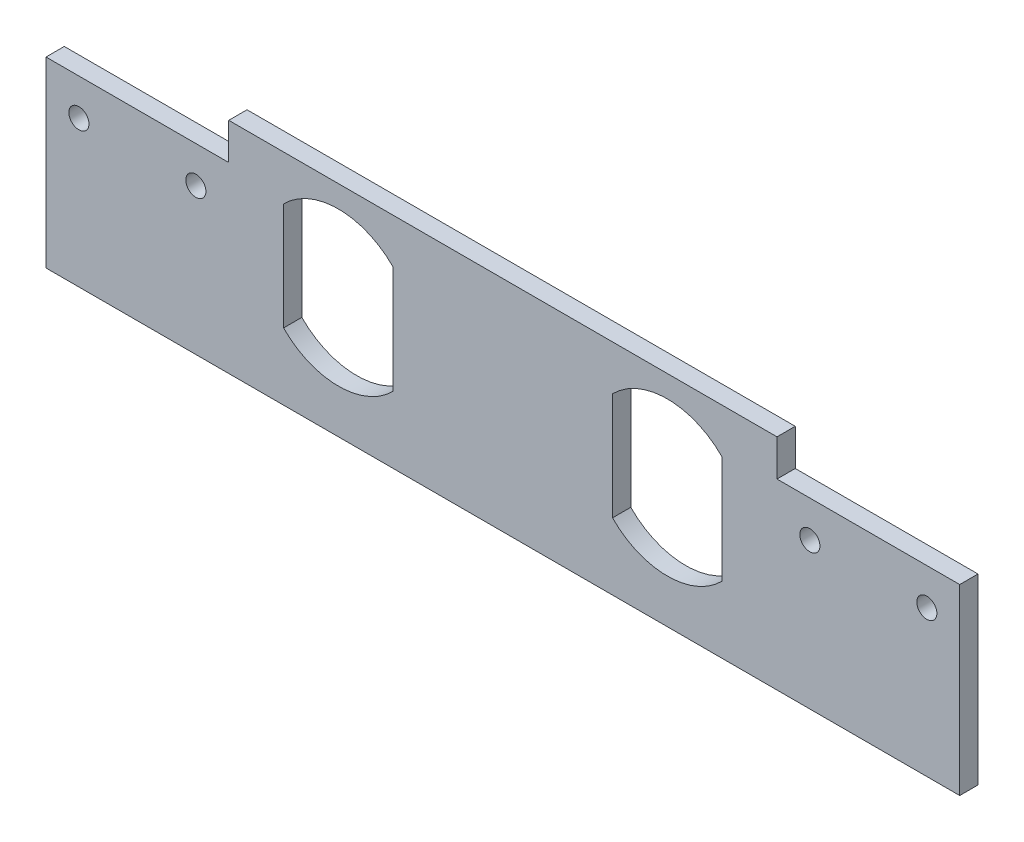
ISO-10303-21;
HEADER;
FILE_DESCRIPTION(('STEP AP214'),'2;1');
FILE_NAME('part.step','',(''),(''),'','','');
FILE_SCHEMA(('AUTOMOTIVE_DESIGN { 1 0 10303 214 1 1 1 1 }'));
ENDSEC;
DATA;
#1=APPLICATION_CONTEXT('core data for automotive mechanical design processes');
#2=APPLICATION_PROTOCOL_DEFINITION('international standard','automotive_design',2000,#1);
#3=PRODUCT_CONTEXT('',#1,'mechanical');
#4=PRODUCT('Part','Part','',(#3));
#5=PRODUCT_RELATED_PRODUCT_CATEGORY('part','',(#4));
#6=PRODUCT_DEFINITION_FORMATION('','',#4);
#7=PRODUCT_DEFINITION_CONTEXT('part definition',#1,'design');
#8=PRODUCT_DEFINITION('design','',#6,#7);
#9=PRODUCT_DEFINITION_SHAPE('','',#8);
#10=(LENGTH_UNIT() NAMED_UNIT(*) SI_UNIT(.MILLI.,.METRE.));
#11=(NAMED_UNIT(*) PLANE_ANGLE_UNIT() SI_UNIT($,.RADIAN.));
#12=(NAMED_UNIT(*) SI_UNIT($,.STERADIAN.) SOLID_ANGLE_UNIT());
#13=UNCERTAINTY_MEASURE_WITH_UNIT(LENGTH_MEASURE(1.E-05),#10,'distance_accuracy_value','');
#14=(GEOMETRIC_REPRESENTATION_CONTEXT(3) GLOBAL_UNCERTAINTY_ASSIGNED_CONTEXT((#13)) GLOBAL_UNIT_ASSIGNED_CONTEXT((#10,
#11,#12)) REPRESENTATION_CONTEXT('',''));
#15=CARTESIAN_POINT('',(0.,0.,0.));
#16=DIRECTION('',(0.,0.,1.));
#17=DIRECTION('',(1.,0.,0.));
#18=AXIS2_PLACEMENT_3D('',#15,#16,#17);
#19=CARTESIAN_POINT('',(0.,0.,5.));
#20=DIRECTION('',(0.,0.,1.));
#21=DIRECTION('',(1.,0.,0.));
#22=AXIS2_PLACEMENT_3D('',#19,#20,#21);
#23=PLANE('',#22);
#24=CARTESIAN_POINT('',(44.9990056497187,8.00000000000002,5.));
#25=DIRECTION('',(0.,0.,1.));
#26=DIRECTION('',(-1.,0.,0.));
#27=AXIS2_PLACEMENT_3D('',#24,#25,#26);
#28=CIRCLE('',#27,21.);
#29=CARTESIAN_POINT('',(59.9990056497187,22.6969384566991,5.));
#30=VERTEX_POINT('',#29);
#31=CARTESIAN_POINT('',(29.9990056497187,22.6969384566991,5.));
#32=VERTEX_POINT('',#31);
#33=EDGE_CURVE('E185',#30,#32,#28,.T.);
#34=ORIENTED_EDGE('',*,*,#33,.F.);
#35=DIRECTION('',(0.,1.,0.));
#36=VECTOR('',#35,1.);
#37=CARTESIAN_POINT('',(59.9990056497187,22.6969384566991,5.));
#38=LINE('',#37,#36);
#39=CARTESIAN_POINT('',(59.9990056497187,-6.69693845669904,5.));
#40=VERTEX_POINT('',#39);
#41=EDGE_CURVE('E200',#40,#30,#38,.T.);
#42=ORIENTED_EDGE('',*,*,#41,.F.);
#43=CARTESIAN_POINT('',(44.9990056497187,8.00000000000002,5.));
#44=DIRECTION('',(0.,0.,1.));
#45=DIRECTION('',(1.,0.,0.));
#46=AXIS2_PLACEMENT_3D('',#43,#44,#45);
#47=CIRCLE('',#46,21.);
#48=CARTESIAN_POINT('',(29.9990056497187,-6.69693845669905,5.));
#49=VERTEX_POINT('',#48);
#50=EDGE_CURVE('E196',#49,#40,#47,.T.);
#51=ORIENTED_EDGE('',*,*,#50,.F.);
#52=DIRECTION('',(0.,-1.,0.));
#53=VECTOR('',#52,1.);
#54=CARTESIAN_POINT('',(29.9990056497187,22.6969384566991,5.));
#55=LINE('',#54,#53);
#56=EDGE_CURVE('E192',#32,#49,#55,.T.);
#57=ORIENTED_EDGE('',*,*,#56,.F.);
#58=EDGE_LOOP('',(#34,#42,#51,#57));
#59=FACE_BOUND('',#58,.T.);
#60=CARTESIAN_POINT('',(-116.,15.,5.));
#61=DIRECTION('',(0.,0.,1.));
#62=DIRECTION('',(1.,0.,0.));
#63=AXIS2_PLACEMENT_3D('',#60,#61,#62);
#64=CIRCLE('',#63,2.75000000000001);
#65=CARTESIAN_POINT('',(-113.25,15.,5.));
#66=VERTEX_POINT('',#65);
#67=EDGE_CURVE('E226',#66,#66,#64,.T.);
#68=ORIENTED_EDGE('',*,*,#67,.F.);
#69=EDGE_LOOP('',(#68));
#70=FACE_BOUND('',#69,.T.);
#71=CARTESIAN_POINT('',(116.,15.,5.));
#72=DIRECTION('',(0.,0.,1.));
#73=DIRECTION('',(-1.,0.,0.));
#74=AXIS2_PLACEMENT_3D('',#71,#72,#73);
#75=CIRCLE('',#74,2.75000000000001);
#76=CARTESIAN_POINT('',(113.25,15.,5.));
#77=VERTEX_POINT('',#76);
#78=EDGE_CURVE('E235',#77,#77,#75,.T.);
#79=ORIENTED_EDGE('',*,*,#78,.F.);
#80=EDGE_LOOP('',(#79));
#81=FACE_BOUND('',#80,.T.);
#82=CARTESIAN_POINT('',(83.9999999999996,15.,5.));
#83=DIRECTION('',(0.,0.,1.));
#84=DIRECTION('',(-1.,0.,0.));
#85=AXIS2_PLACEMENT_3D('',#82,#83,#84);
#86=CIRCLE('',#85,2.75000000000001);
#87=CARTESIAN_POINT('',(81.2499999999996,15.,5.));
#88=VERTEX_POINT('',#87);
#89=EDGE_CURVE('E218',#88,#88,#86,.T.);
#90=ORIENTED_EDGE('',*,*,#89,.F.);
#91=EDGE_LOOP('',(#90));
#92=FACE_BOUND('',#91,.T.);
#93=CARTESIAN_POINT('',(-83.9999999999996,15.,5.));
#94=DIRECTION('',(0.,0.,1.));
#95=DIRECTION('',(1.,0.,0.));
#96=AXIS2_PLACEMENT_3D('',#93,#94,#95);
#97=CIRCLE('',#96,2.75000000000001);
#98=CARTESIAN_POINT('',(-81.2499999999996,15.,5.));
#99=VERTEX_POINT('',#98);
#100=EDGE_CURVE('E230',#99,#99,#97,.T.);
#101=ORIENTED_EDGE('',*,*,#100,.F.);
#102=EDGE_LOOP('',(#101));
#103=FACE_BOUND('',#102,.T.);
#104=DIRECTION('',(1.,0.,0.));
#105=VECTOR('',#104,1.);
#106=CARTESIAN_POINT('',(-145.,-25.,5.));
#107=LINE('',#106,#105);
#108=CARTESIAN_POINT('',(-125.,-25.,5.));
#109=VERTEX_POINT('',#108);
#110=CARTESIAN_POINT('',(125.,-25.,5.));
#111=VERTEX_POINT('',#110);
#112=EDGE_CURVE('E313',#109,#111,#107,.T.);
#113=ORIENTED_EDGE('',*,*,#112,.T.);
#114=DIRECTION('',(0.,1.,0.));
#115=VECTOR('',#114,1.);
#116=CARTESIAN_POINT('',(125.,25.,5.));
#117=LINE('',#116,#115);
#118=CARTESIAN_POINT('',(125.,25.,5.));
#119=VERTEX_POINT('',#118);
#120=EDGE_CURVE('E286',#111,#119,#117,.T.);
#121=ORIENTED_EDGE('',*,*,#120,.T.);
#122=DIRECTION('',(-1.,0.,0.));
#123=VECTOR('',#122,1.);
#124=CARTESIAN_POINT('',(-145.,25.,5.));
#125=LINE('',#124,#123);
#126=CARTESIAN_POINT('',(74.9999999999996,25.,5.));
#127=VERTEX_POINT('',#126);
#128=EDGE_CURVE('E309',#119,#127,#125,.T.);
#129=ORIENTED_EDGE('',*,*,#128,.T.);
#130=DIRECTION('',(0.,-1.,0.));
#131=VECTOR('',#130,1.);
#132=CARTESIAN_POINT('',(74.9999999999996,35.,5.));
#133=LINE('',#132,#131);
#134=CARTESIAN_POINT('',(74.9999999999996,35.,5.));
#135=VERTEX_POINT('',#134);
#136=EDGE_CURVE('E264',#135,#127,#133,.T.);
#137=ORIENTED_EDGE('',*,*,#136,.F.);
#138=DIRECTION('',(1.,0.,0.));
#139=VECTOR('',#138,1.);
#140=CARTESIAN_POINT('',(74.9999999999996,35.,5.));
#141=LINE('',#140,#139);
#142=CARTESIAN_POINT('',(-74.9999999999996,35.,5.));
#143=VERTEX_POINT('',#142);
#144=EDGE_CURVE('E261',#143,#135,#141,.T.);
#145=ORIENTED_EDGE('',*,*,#144,.F.);
#146=DIRECTION('',(0.,-1.,0.));
#147=VECTOR('',#146,1.);
#148=CARTESIAN_POINT('',(-74.9999999999996,35.,5.));
#149=LINE('',#148,#147);
#150=CARTESIAN_POINT('',(-74.9999999999996,25.,5.));
#151=VERTEX_POINT('',#150);
#152=EDGE_CURVE('E274',#143,#151,#149,.T.);
#153=ORIENTED_EDGE('',*,*,#152,.T.);
#154=CARTESIAN_POINT('',(-125.,25.,5.));
#155=VERTEX_POINT('',#154);
#156=EDGE_CURVE('E314',#151,#155,#125,.T.);
#157=ORIENTED_EDGE('',*,*,#156,.T.);
#158=DIRECTION('',(0.,1.,0.));
#159=VECTOR('',#158,1.);
#160=CARTESIAN_POINT('',(-125.,25.,5.));
#161=LINE('',#160,#159);
#162=EDGE_CURVE('E295',#109,#155,#161,.T.);
#163=ORIENTED_EDGE('',*,*,#162,.F.);
#164=EDGE_LOOP('',(#113,#121,#129,#137,#145,#153,#157,#163));
#165=FACE_BOUND('',#164,.T.);
#166=DIRECTION('',(0.,1.,0.));
#167=VECTOR('',#166,1.);
#168=CARTESIAN_POINT('',(-59.9990056497187,22.6969384566991,5.));
#169=LINE('',#168,#167);
#170=CARTESIAN_POINT('',(-59.9990056497187,-6.69693845669904,5.));
#171=VERTEX_POINT('',#170);
#172=CARTESIAN_POINT('',(-59.9990056497187,22.6969384566991,5.));
#173=VERTEX_POINT('',#172);
#174=EDGE_CURVE('E169',#171,#173,#169,.T.);
#175=ORIENTED_EDGE('',*,*,#174,.T.);
#176=CARTESIAN_POINT('',(-44.9990056497187,8.00000000000002,5.));
#177=DIRECTION('',(0.,0.,-1.));
#178=DIRECTION('',(1.,0.,0.));
#179=AXIS2_PLACEMENT_3D('',#176,#177,#178);
#180=CIRCLE('',#179,21.);
#181=CARTESIAN_POINT('',(-29.9990056497187,22.6969384566991,5.));
#182=VERTEX_POINT('',#181);
#183=EDGE_CURVE('E59',#173,#182,#180,.T.);
#184=ORIENTED_EDGE('',*,*,#183,.T.);
#185=DIRECTION('',(0.,-1.,0.));
#186=VECTOR('',#185,1.);
#187=CARTESIAN_POINT('',(-29.9990056497187,22.6969384566991,5.));
#188=LINE('',#187,#186);
#189=CARTESIAN_POINT('',(-29.9990056497187,-6.69693845669905,5.));
#190=VERTEX_POINT('',#189);
#191=EDGE_CURVE('E175',#182,#190,#188,.T.);
#192=ORIENTED_EDGE('',*,*,#191,.T.);
#193=CARTESIAN_POINT('',(-44.9990056497187,8.00000000000002,5.));
#194=DIRECTION('',(0.,0.,-1.));
#195=DIRECTION('',(-1.,0.,0.));
#196=AXIS2_PLACEMENT_3D('',#193,#194,#195);
#197=CIRCLE('',#196,21.);
#198=EDGE_CURVE('E159',#190,#171,#197,.T.);
#199=ORIENTED_EDGE('',*,*,#198,.T.);
#200=EDGE_LOOP('',(#175,#184,#192,#199));
#201=FACE_BOUND('',#200,.T.);
#202=ADVANCED_FACE('F43',(#59,#70,#81,#92,#103,#165,#201),#23,.T.);
#203=CARTESIAN_POINT('',(0.,0.,0.));
#204=DIRECTION('',(0.,0.,1.));
#205=DIRECTION('',(1.,0.,0.));
#206=AXIS2_PLACEMENT_3D('',#203,#204,#205);
#207=PLANE('',#206);
#208=DIRECTION('',(0.,1.,0.));
#209=VECTOR('',#208,1.);
#210=CARTESIAN_POINT('',(125.,0.,0.));
#211=LINE('',#210,#209);
#212=CARTESIAN_POINT('',(125.,-25.,0.));
#213=VERTEX_POINT('',#212);
#214=CARTESIAN_POINT('',(125.,25.,0.));
#215=VERTEX_POINT('',#214);
#216=EDGE_CURVE('E329',#213,#215,#211,.T.);
#217=ORIENTED_EDGE('',*,*,#216,.F.);
#218=DIRECTION('',(1.,0.,0.));
#219=VECTOR('',#218,1.);
#220=CARTESIAN_POINT('',(-145.,-25.,0.));
#221=LINE('',#220,#219);
#222=CARTESIAN_POINT('',(-125.,-25.,0.));
#223=VERTEX_POINT('',#222);
#224=EDGE_CURVE('E322',#223,#213,#221,.T.);
#225=ORIENTED_EDGE('',*,*,#224,.F.);
#226=DIRECTION('',(0.,1.,0.));
#227=VECTOR('',#226,1.);
#228=CARTESIAN_POINT('',(-125.,0.,0.));
#229=LINE('',#228,#227);
#230=CARTESIAN_POINT('',(-125.,25.,0.));
#231=VERTEX_POINT('',#230);
#232=EDGE_CURVE('E318',#223,#231,#229,.T.);
#233=ORIENTED_EDGE('',*,*,#232,.T.);
#234=DIRECTION('',(-1.,0.,0.));
#235=VECTOR('',#234,1.);
#236=CARTESIAN_POINT('',(-145.,25.,0.));
#237=LINE('',#236,#235);
#238=CARTESIAN_POINT('',(-74.9999999999996,25.,0.));
#239=VERTEX_POINT('',#238);
#240=EDGE_CURVE('E306',#239,#231,#237,.T.);
#241=ORIENTED_EDGE('',*,*,#240,.F.);
#242=DIRECTION('',(0.,-1.,0.));
#243=VECTOR('',#242,1.);
#244=CARTESIAN_POINT('',(-74.9999999999996,35.,0.));
#245=LINE('',#244,#243);
#246=CARTESIAN_POINT('',(-74.9999999999996,35.,0.));
#247=VERTEX_POINT('',#246);
#248=EDGE_CURVE('E278',#247,#239,#245,.T.);
#249=ORIENTED_EDGE('',*,*,#248,.F.);
#250=DIRECTION('',(-1.,0.,0.));
#251=VECTOR('',#250,1.);
#252=CARTESIAN_POINT('',(74.9999999999996,35.,0.));
#253=LINE('',#252,#251);
#254=CARTESIAN_POINT('',(74.9999999999996,35.,0.));
#255=VERTEX_POINT('',#254);
#256=EDGE_CURVE('E254',#255,#247,#253,.T.);
#257=ORIENTED_EDGE('',*,*,#256,.F.);
#258=DIRECTION('',(0.,-1.,0.));
#259=VECTOR('',#258,1.);
#260=CARTESIAN_POINT('',(74.9999999999996,35.,0.));
#261=LINE('',#260,#259);
#262=CARTESIAN_POINT('',(74.9999999999996,25.,0.));
#263=VERTEX_POINT('',#262);
#264=EDGE_CURVE('E282',#255,#263,#261,.T.);
#265=ORIENTED_EDGE('',*,*,#264,.T.);
#266=EDGE_CURVE('E319',#215,#263,#237,.T.);
#267=ORIENTED_EDGE('',*,*,#266,.F.);
#268=EDGE_LOOP('',(#217,#225,#233,#241,#249,#257,#265,#267));
#269=FACE_BOUND('',#268,.T.);
#270=CARTESIAN_POINT('',(-83.9999999999996,15.,0.));
#271=DIRECTION('',(0.,0.,1.));
#272=DIRECTION('',(1.,0.,0.));
#273=AXIS2_PLACEMENT_3D('',#270,#271,#272);
#274=CIRCLE('',#273,2.75000000000001);
#275=CARTESIAN_POINT('',(-81.2499999999996,15.,0.));
#276=VERTEX_POINT('',#275);
#277=EDGE_CURVE('E242',#276,#276,#274,.T.);
#278=ORIENTED_EDGE('',*,*,#277,.T.);
#279=EDGE_LOOP('',(#278));
#280=FACE_BOUND('',#279,.T.);
#281=CARTESIAN_POINT('',(83.9999999999996,15.,0.));
#282=DIRECTION('',(0.,0.,1.));
#283=DIRECTION('',(-1.,0.,0.));
#284=AXIS2_PLACEMENT_3D('',#281,#282,#283);
#285=CIRCLE('',#284,2.75000000000001);
#286=CARTESIAN_POINT('',(81.2499999999996,15.,0.));
#287=VERTEX_POINT('',#286);
#288=EDGE_CURVE('E208',#287,#287,#285,.T.);
#289=ORIENTED_EDGE('',*,*,#288,.T.);
#290=EDGE_LOOP('',(#289));
#291=FACE_BOUND('',#290,.T.);
#292=CARTESIAN_POINT('',(116.,15.,0.));
#293=DIRECTION('',(0.,0.,1.));
#294=DIRECTION('',(-1.,0.,0.));
#295=AXIS2_PLACEMENT_3D('',#292,#293,#294);
#296=CIRCLE('',#295,2.75000000000001);
#297=CARTESIAN_POINT('',(113.25,15.,0.));
#298=VERTEX_POINT('',#297);
#299=EDGE_CURVE('E222',#298,#298,#296,.T.);
#300=ORIENTED_EDGE('',*,*,#299,.T.);
#301=EDGE_LOOP('',(#300));
#302=FACE_BOUND('',#301,.T.);
#303=CARTESIAN_POINT('',(-116.,15.,0.));
#304=DIRECTION('',(0.,0.,1.));
#305=DIRECTION('',(1.,0.,0.));
#306=AXIS2_PLACEMENT_3D('',#303,#304,#305);
#307=CIRCLE('',#306,2.75000000000001);
#308=CARTESIAN_POINT('',(-113.25,15.,0.));
#309=VERTEX_POINT('',#308);
#310=EDGE_CURVE('E231',#309,#309,#307,.T.);
#311=ORIENTED_EDGE('',*,*,#310,.T.);
#312=EDGE_LOOP('',(#311));
#313=FACE_BOUND('',#312,.T.);
#314=DIRECTION('',(0.,1.,0.));
#315=VECTOR('',#314,1.);
#316=CARTESIAN_POINT('',(59.9990056497187,0.,0.));
#317=LINE('',#316,#315);
#318=CARTESIAN_POINT('',(59.9990056497187,-6.69693845669904,0.));
#319=VERTEX_POINT('',#318);
#320=CARTESIAN_POINT('',(59.9990056497187,22.6969384566991,0.));
#321=VERTEX_POINT('',#320);
#322=EDGE_CURVE('E340',#319,#321,#317,.T.);
#323=ORIENTED_EDGE('',*,*,#322,.T.);
#324=CARTESIAN_POINT('',(44.9990056497187,8.00000000000002,0.));
#325=DIRECTION('',(0.,0.,1.));
#326=DIRECTION('',(1.,0.,0.));
#327=AXIS2_PLACEMENT_3D('',#324,#325,#326);
#328=CIRCLE('',#327,21.);
#329=CARTESIAN_POINT('',(29.9990056497187,22.6969384566991,0.));
#330=VERTEX_POINT('',#329);
#331=EDGE_CURVE('E344',#321,#330,#328,.T.);
#332=ORIENTED_EDGE('',*,*,#331,.T.);
#333=DIRECTION('',(0.,-1.,0.));
#334=VECTOR('',#333,1.);
#335=CARTESIAN_POINT('',(29.9990056497187,0.,0.));
#336=LINE('',#335,#334);
#337=CARTESIAN_POINT('',(29.9990056497187,-6.69693845669905,0.));
#338=VERTEX_POINT('',#337);
#339=EDGE_CURVE('E332',#330,#338,#336,.T.);
#340=ORIENTED_EDGE('',*,*,#339,.T.);
#341=CARTESIAN_POINT('',(44.9990056497187,8.00000000000002,0.));
#342=DIRECTION('',(0.,0.,1.));
#343=DIRECTION('',(1.,0.,0.));
#344=AXIS2_PLACEMENT_3D('',#341,#342,#343);
#345=CIRCLE('',#344,21.);
#346=EDGE_CURVE('E336',#338,#319,#345,.T.);
#347=ORIENTED_EDGE('',*,*,#346,.T.);
#348=EDGE_LOOP('',(#323,#332,#340,#347));
#349=FACE_BOUND('',#348,.T.);
#350=CARTESIAN_POINT('',(-44.9990056497187,8.00000000000002,0.));
#351=DIRECTION('',(0.,0.,1.));
#352=DIRECTION('',(1.,0.,0.));
#353=AXIS2_PLACEMENT_3D('',#350,#351,#352);
#354=CIRCLE('',#353,21.);
#355=CARTESIAN_POINT('',(-59.9990056497187,22.6969384566991,0.));
#356=VERTEX_POINT('',#355);
#357=CARTESIAN_POINT('',(-29.9990056497187,22.6969384566991,0.));
#358=VERTEX_POINT('',#357);
#359=EDGE_CURVE('E11',#356,#358,#354,.F.);
#360=ORIENTED_EDGE('',*,*,#359,.F.);
#361=DIRECTION('',(0.,1.,0.));
#362=VECTOR('',#361,1.);
#363=CARTESIAN_POINT('',(-59.9990056497187,0.,0.));
#364=LINE('',#363,#362);
#365=CARTESIAN_POINT('',(-59.9990056497187,-6.69693845669904,0.));
#366=VERTEX_POINT('',#365);
#367=EDGE_CURVE('E348',#366,#356,#364,.T.);
#368=ORIENTED_EDGE('',*,*,#367,.F.);
#369=CARTESIAN_POINT('',(-44.9990056497187,8.00000000000002,0.));
#370=DIRECTION('',(0.,0.,1.));
#371=DIRECTION('',(1.,0.,0.));
#372=AXIS2_PLACEMENT_3D('',#369,#370,#371);
#373=CIRCLE('',#372,21.);
#374=CARTESIAN_POINT('',(-29.9990056497187,-6.69693845669905,0.));
#375=VERTEX_POINT('',#374);
#376=EDGE_CURVE('E162',#375,#366,#373,.F.);
#377=ORIENTED_EDGE('',*,*,#376,.F.);
#378=DIRECTION('',(0.,-1.,0.));
#379=VECTOR('',#378,1.);
#380=CARTESIAN_POINT('',(-29.9990056497187,0.,0.));
#381=LINE('',#380,#379);
#382=EDGE_CURVE('E52',#358,#375,#381,.T.);
#383=ORIENTED_EDGE('',*,*,#382,.F.);
#384=EDGE_LOOP('',(#360,#368,#377,#383));
#385=FACE_BOUND('',#384,.T.);
#386=ADVANCED_FACE('F359',(#269,#280,#291,#302,#313,#349,#385),#207,.F.);
#387=CARTESIAN_POINT('',(-145.,25.,5.));
#388=DIRECTION('',(0.,-1.,0.));
#389=DIRECTION('',(0.,0.,-1.));
#390=AXIS2_PLACEMENT_3D('',#387,#388,#389);
#391=PLANE('',#390);
#392=DIRECTION('',(0.,0.,-1.));
#393=VECTOR('',#392,1.);
#394=CARTESIAN_POINT('',(74.9999999999996,25.,0.));
#395=LINE('',#394,#393);
#396=EDGE_CURVE('E246',#127,#263,#395,.T.);
#397=ORIENTED_EDGE('',*,*,#396,.F.);
#398=ORIENTED_EDGE('',*,*,#128,.F.);
#399=DIRECTION('',(0.,0.,1.));
#400=VECTOR('',#399,1.);
#401=CARTESIAN_POINT('',(125.,25.,-5.));
#402=LINE('',#401,#400);
#403=EDGE_CURVE('E290',#215,#119,#402,.T.);
#404=ORIENTED_EDGE('',*,*,#403,.F.);
#405=ORIENTED_EDGE('',*,*,#266,.T.);
#406=EDGE_LOOP('',(#397,#398,#404,#405));
#407=FACE_BOUND('',#406,.T.);
#408=ADVANCED_FACE('F45',(#407),#391,.F.);
#409=DIRECTION('',(0.,0.,1.));
#410=VECTOR('',#409,1.);
#411=CARTESIAN_POINT('',(-74.9999999999996,25.,0.));
#412=LINE('',#411,#410);
#413=EDGE_CURVE('E255',#239,#151,#412,.T.);
#414=ORIENTED_EDGE('',*,*,#413,.F.);
#415=ORIENTED_EDGE('',*,*,#240,.T.);
#416=DIRECTION('',(0.,0.,1.));
#417=VECTOR('',#416,1.);
#418=CARTESIAN_POINT('',(-125.,25.,-5.));
#419=LINE('',#418,#417);
#420=EDGE_CURVE('E302',#231,#155,#419,.T.);
#421=ORIENTED_EDGE('',*,*,#420,.T.);
#422=ORIENTED_EDGE('',*,*,#156,.F.);
#423=EDGE_LOOP('',(#414,#415,#421,#422));
#424=FACE_BOUND('',#423,.T.);
#425=ADVANCED_FACE('F391',(#424),#391,.F.);
#426=CARTESIAN_POINT('',(-145.,-25.,5.));
#427=DIRECTION('',(0.,1.,0.));
#428=DIRECTION('',(0.,0.,1.));
#429=AXIS2_PLACEMENT_3D('',#426,#427,#428);
#430=PLANE('',#429);
#431=DIRECTION('',(0.,0.,1.));
#432=VECTOR('',#431,1.);
#433=CARTESIAN_POINT('',(125.,-25.,-5.));
#434=LINE('',#433,#432);
#435=EDGE_CURVE('E291',#213,#111,#434,.T.);
#436=ORIENTED_EDGE('',*,*,#435,.T.);
#437=ORIENTED_EDGE('',*,*,#112,.F.);
#438=DIRECTION('',(0.,0.,1.));
#439=VECTOR('',#438,1.);
#440=CARTESIAN_POINT('',(-125.,-25.,-5.));
#441=LINE('',#440,#439);
#442=EDGE_CURVE('E301',#223,#109,#441,.T.);
#443=ORIENTED_EDGE('',*,*,#442,.F.);
#444=ORIENTED_EDGE('',*,*,#224,.T.);
#445=EDGE_LOOP('',(#436,#437,#443,#444));
#446=FACE_BOUND('',#445,.T.);
#447=ADVANCED_FACE('F389',(#446),#430,.F.);
#448=CARTESIAN_POINT('',(-125.,25.,-5.));
#449=DIRECTION('',(1.,0.,0.));
#450=DIRECTION('',(0.,1.,0.));
#451=AXIS2_PLACEMENT_3D('',#448,#449,#450);
#452=PLANE('',#451);
#453=ORIENTED_EDGE('',*,*,#442,.T.);
#454=ORIENTED_EDGE('',*,*,#162,.T.);
#455=ORIENTED_EDGE('',*,*,#420,.F.);
#456=ORIENTED_EDGE('',*,*,#232,.F.);
#457=EDGE_LOOP('',(#453,#454,#455,#456));
#458=FACE_BOUND('',#457,.T.);
#459=ADVANCED_FACE('F387',(#458),#452,.F.);
#460=CARTESIAN_POINT('',(125.,25.,-5.));
#461=DIRECTION('',(1.,0.,0.));
#462=DIRECTION('',(0.,1.,0.));
#463=AXIS2_PLACEMENT_3D('',#460,#461,#462);
#464=PLANE('',#463);
#465=ORIENTED_EDGE('',*,*,#216,.T.);
#466=ORIENTED_EDGE('',*,*,#403,.T.);
#467=ORIENTED_EDGE('',*,*,#120,.F.);
#468=ORIENTED_EDGE('',*,*,#435,.F.);
#469=EDGE_LOOP('',(#465,#466,#467,#468));
#470=FACE_BOUND('',#469,.T.);
#471=ADVANCED_FACE('F398',(#470),#464,.T.);
#472=CARTESIAN_POINT('',(74.9999999999996,35.,0.));
#473=DIRECTION('',(-1.,0.,0.));
#474=DIRECTION('',(0.,0.,1.));
#475=AXIS2_PLACEMENT_3D('',#472,#473,#474);
#476=PLANE('',#475);
#477=ORIENTED_EDGE('',*,*,#396,.T.);
#478=ORIENTED_EDGE('',*,*,#264,.F.);
#479=DIRECTION('',(0.,0.,-1.));
#480=VECTOR('',#479,1.);
#481=CARTESIAN_POINT('',(74.9999999999996,35.,0.));
#482=LINE('',#481,#480);
#483=EDGE_CURVE('E250',#135,#255,#482,.T.);
#484=ORIENTED_EDGE('',*,*,#483,.F.);
#485=ORIENTED_EDGE('',*,*,#136,.T.);
#486=EDGE_LOOP('',(#477,#478,#484,#485));
#487=FACE_BOUND('',#486,.T.);
#488=ADVANCED_FACE('F428',(#487),#476,.F.);
#489=CARTESIAN_POINT('',(-74.9999999999996,35.,0.));
#490=DIRECTION('',(1.,0.,0.));
#491=DIRECTION('',(0.,0.,-1.));
#492=AXIS2_PLACEMENT_3D('',#489,#490,#491);
#493=PLANE('',#492);
#494=ORIENTED_EDGE('',*,*,#413,.T.);
#495=ORIENTED_EDGE('',*,*,#152,.F.);
#496=DIRECTION('',(0.,0.,1.));
#497=VECTOR('',#496,1.);
#498=CARTESIAN_POINT('',(-74.9999999999996,35.,0.));
#499=LINE('',#498,#497);
#500=EDGE_CURVE('E258',#247,#143,#499,.T.);
#501=ORIENTED_EDGE('',*,*,#500,.F.);
#502=ORIENTED_EDGE('',*,*,#248,.T.);
#503=EDGE_LOOP('',(#494,#495,#501,#502));
#504=FACE_BOUND('',#503,.T.);
#505=ADVANCED_FACE('F418',(#504),#493,.F.);
#506=CARTESIAN_POINT('',(0.,35.,0.));
#507=DIRECTION('',(0.,-1.,0.));
#508=DIRECTION('',(0.,0.,-1.));
#509=AXIS2_PLACEMENT_3D('',#506,#507,#508);
#510=PLANE('',#509);
#511=ORIENTED_EDGE('',*,*,#483,.T.);
#512=ORIENTED_EDGE('',*,*,#256,.T.);
#513=ORIENTED_EDGE('',*,*,#500,.T.);
#514=ORIENTED_EDGE('',*,*,#144,.T.);
#515=EDGE_LOOP('',(#511,#512,#513,#514));
#516=FACE_BOUND('',#515,.T.);
#517=ADVANCED_FACE('F422',(#516),#510,.F.);
#518=CARTESIAN_POINT('',(-83.9999999999996,15.,0.));
#519=DIRECTION('',(0.,0.,1.));
#520=DIRECTION('',(1.,0.,0.));
#521=AXIS2_PLACEMENT_3D('',#518,#519,#520);
#522=CYLINDRICAL_SURFACE('',#521,2.75000000000001);
#523=ORIENTED_EDGE('',*,*,#277,.F.);
#524=EDGE_LOOP('',(#523));
#525=FACE_BOUND('',#524,.T.);
#526=ORIENTED_EDGE('',*,*,#100,.T.);
#527=EDGE_LOOP('',(#526));
#528=FACE_BOUND('',#527,.T.);
#529=ADVANCED_FACE('F440',(#525,#528),#522,.F.);
#530=CARTESIAN_POINT('',(83.9999999999996,15.,0.));
#531=DIRECTION('',(0.,0.,1.));
#532=DIRECTION('',(1.,0.,0.));
#533=AXIS2_PLACEMENT_3D('',#530,#531,#532);
#534=CYLINDRICAL_SURFACE('',#533,2.75000000000001);
#535=ORIENTED_EDGE('',*,*,#288,.F.);
#536=EDGE_LOOP('',(#535));
#537=FACE_BOUND('',#536,.T.);
#538=ORIENTED_EDGE('',*,*,#89,.T.);
#539=EDGE_LOOP('',(#538));
#540=FACE_BOUND('',#539,.T.);
#541=ADVANCED_FACE('F443',(#537,#540),#534,.F.);
#542=CARTESIAN_POINT('',(116.,15.,0.));
#543=DIRECTION('',(0.,0.,1.));
#544=DIRECTION('',(1.,0.,0.));
#545=AXIS2_PLACEMENT_3D('',#542,#543,#544);
#546=CYLINDRICAL_SURFACE('',#545,2.75000000000001);
#547=ORIENTED_EDGE('',*,*,#299,.F.);
#548=EDGE_LOOP('',(#547));
#549=FACE_BOUND('',#548,.T.);
#550=ORIENTED_EDGE('',*,*,#78,.T.);
#551=EDGE_LOOP('',(#550));
#552=FACE_BOUND('',#551,.T.);
#553=ADVANCED_FACE('F445',(#549,#552),#546,.F.);
#554=CARTESIAN_POINT('',(-116.,15.,0.));
#555=DIRECTION('',(0.,0.,1.));
#556=DIRECTION('',(1.,0.,0.));
#557=AXIS2_PLACEMENT_3D('',#554,#555,#556);
#558=CYLINDRICAL_SURFACE('',#557,2.75000000000001);
#559=ORIENTED_EDGE('',*,*,#310,.F.);
#560=EDGE_LOOP('',(#559));
#561=FACE_BOUND('',#560,.T.);
#562=ORIENTED_EDGE('',*,*,#67,.T.);
#563=EDGE_LOOP('',(#562));
#564=FACE_BOUND('',#563,.T.);
#565=ADVANCED_FACE('F448',(#561,#564),#558,.F.);
#566=CARTESIAN_POINT('',(44.9990056497187,8.00000000000002,-5.));
#567=DIRECTION('',(0.,0.,1.));
#568=DIRECTION('',(1.,0.,0.));
#569=AXIS2_PLACEMENT_3D('',#566,#567,#568);
#570=CYLINDRICAL_SURFACE('',#569,21.);
#571=DIRECTION('',(0.,0.,1.));
#572=VECTOR('',#571,1.);
#573=CARTESIAN_POINT('',(59.9990056497187,22.6969384566991,-5.));
#574=LINE('',#573,#572);
#575=EDGE_CURVE('E205',#321,#30,#574,.T.);
#576=ORIENTED_EDGE('',*,*,#575,.T.);
#577=ORIENTED_EDGE('',*,*,#33,.T.);
#578=DIRECTION('',(0.,0.,1.));
#579=VECTOR('',#578,1.);
#580=CARTESIAN_POINT('',(29.9990056497187,22.6969384566991,-5.));
#581=LINE('',#580,#579);
#582=EDGE_CURVE('E204',#330,#32,#581,.T.);
#583=ORIENTED_EDGE('',*,*,#582,.F.);
#584=ORIENTED_EDGE('',*,*,#331,.F.);
#585=EDGE_LOOP('',(#576,#577,#583,#584));
#586=FACE_BOUND('',#585,.T.);
#587=ADVANCED_FACE('F452',(#586),#570,.F.);
#588=CARTESIAN_POINT('',(59.9990056497187,22.6969384566991,-5.));
#589=DIRECTION('',(1.,0.,0.));
#590=DIRECTION('',(0.,0.,-1.));
#591=AXIS2_PLACEMENT_3D('',#588,#589,#590);
#592=PLANE('',#591);
#593=DIRECTION('',(0.,0.,1.));
#594=VECTOR('',#593,1.);
#595=CARTESIAN_POINT('',(59.9990056497187,-6.69693845669904,-5.));
#596=LINE('',#595,#594);
#597=EDGE_CURVE('E209',#319,#40,#596,.T.);
#598=ORIENTED_EDGE('',*,*,#597,.T.);
#599=ORIENTED_EDGE('',*,*,#41,.T.);
#600=ORIENTED_EDGE('',*,*,#575,.F.);
#601=ORIENTED_EDGE('',*,*,#322,.F.);
#602=EDGE_LOOP('',(#598,#599,#600,#601));
#603=FACE_BOUND('',#602,.T.);
#604=ADVANCED_FACE('F458',(#603),#592,.F.);
#605=CARTESIAN_POINT('',(44.9990056497187,8.00000000000002,-5.));
#606=DIRECTION('',(0.,0.,1.));
#607=DIRECTION('',(1.,0.,0.));
#608=AXIS2_PLACEMENT_3D('',#605,#606,#607);
#609=CYLINDRICAL_SURFACE('',#608,21.);
#610=DIRECTION('',(0.,0.,1.));
#611=VECTOR('',#610,1.);
#612=CARTESIAN_POINT('',(29.9990056497187,-6.69693845669905,-5.));
#613=LINE('',#612,#611);
#614=EDGE_CURVE('E212',#338,#49,#613,.T.);
#615=ORIENTED_EDGE('',*,*,#614,.T.);
#616=ORIENTED_EDGE('',*,*,#50,.T.);
#617=ORIENTED_EDGE('',*,*,#597,.F.);
#618=ORIENTED_EDGE('',*,*,#346,.F.);
#619=EDGE_LOOP('',(#615,#616,#617,#618));
#620=FACE_BOUND('',#619,.T.);
#621=ADVANCED_FACE('F370',(#620),#609,.F.);
#622=CARTESIAN_POINT('',(29.9990056497187,22.6969384566991,-5.));
#623=DIRECTION('',(-1.,0.,0.));
#624=DIRECTION('',(0.,0.,1.));
#625=AXIS2_PLACEMENT_3D('',#622,#623,#624);
#626=PLANE('',#625);
#627=ORIENTED_EDGE('',*,*,#582,.T.);
#628=ORIENTED_EDGE('',*,*,#56,.T.);
#629=ORIENTED_EDGE('',*,*,#614,.F.);
#630=ORIENTED_EDGE('',*,*,#339,.F.);
#631=EDGE_LOOP('',(#627,#628,#629,#630));
#632=FACE_BOUND('',#631,.T.);
#633=ADVANCED_FACE('F363',(#632),#626,.F.);
#634=CARTESIAN_POINT('',(-44.9990056497187,8.00000000000002,-5.));
#635=DIRECTION('',(0.,0.,1.));
#636=DIRECTION('',(1.,0.,0.));
#637=AXIS2_PLACEMENT_3D('',#634,#635,#636);
#638=CYLINDRICAL_SURFACE('',#637,21.);
#639=ORIENTED_EDGE('',*,*,#359,.T.);
#640=DIRECTION('',(0.,0.,1.));
#641=VECTOR('',#640,1.);
#642=CARTESIAN_POINT('',(-29.9990056497187,22.6969384566991,-5.));
#643=LINE('',#642,#641);
#644=EDGE_CURVE('E182',#358,#182,#643,.T.);
#645=ORIENTED_EDGE('',*,*,#644,.T.);
#646=ORIENTED_EDGE('',*,*,#183,.F.);
#647=DIRECTION('',(0.,0.,1.));
#648=VECTOR('',#647,1.);
#649=CARTESIAN_POINT('',(-59.9990056497187,22.6969384566991,-5.));
#650=LINE('',#649,#648);
#651=EDGE_CURVE('E166',#356,#173,#650,.T.);
#652=ORIENTED_EDGE('',*,*,#651,.F.);
#653=EDGE_LOOP('',(#639,#645,#646,#652));
#654=FACE_BOUND('',#653,.T.);
#655=ADVANCED_FACE('F360',(#654),#638,.F.);
#656=CARTESIAN_POINT('',(-29.9990056497187,22.6969384566991,-5.));
#657=DIRECTION('',(-1.,0.,0.));
#658=DIRECTION('',(0.,0.,1.));
#659=AXIS2_PLACEMENT_3D('',#656,#657,#658);
#660=PLANE('',#659);
#661=ORIENTED_EDGE('',*,*,#382,.T.);
#662=DIRECTION('',(0.,0.,1.));
#663=VECTOR('',#662,1.);
#664=CARTESIAN_POINT('',(-29.9990056497187,-6.69693845669905,-5.));
#665=LINE('',#664,#663);
#666=EDGE_CURVE('E165',#375,#190,#665,.T.);
#667=ORIENTED_EDGE('',*,*,#666,.T.);
#668=ORIENTED_EDGE('',*,*,#191,.F.);
#669=ORIENTED_EDGE('',*,*,#644,.F.);
#670=EDGE_LOOP('',(#661,#667,#668,#669));
#671=FACE_BOUND('',#670,.T.);
#672=ADVANCED_FACE('F356',(#671),#660,.T.);
#673=CARTESIAN_POINT('',(-44.9990056497187,8.00000000000002,-5.));
#674=DIRECTION('',(0.,0.,1.));
#675=DIRECTION('',(1.,0.,0.));
#676=AXIS2_PLACEMENT_3D('',#673,#674,#675);
#677=CYLINDRICAL_SURFACE('',#676,21.);
#678=ORIENTED_EDGE('',*,*,#376,.T.);
#679=DIRECTION('',(0.,0.,1.));
#680=VECTOR('',#679,1.);
#681=CARTESIAN_POINT('',(-59.9990056497187,-6.69693845669904,-5.));
#682=LINE('',#681,#680);
#683=EDGE_CURVE('E67',#366,#171,#682,.T.);
#684=ORIENTED_EDGE('',*,*,#683,.T.);
#685=ORIENTED_EDGE('',*,*,#198,.F.);
#686=ORIENTED_EDGE('',*,*,#666,.F.);
#687=EDGE_LOOP('',(#678,#684,#685,#686));
#688=FACE_BOUND('',#687,.T.);
#689=ADVANCED_FACE('F156',(#688),#677,.F.);
#690=CARTESIAN_POINT('',(-59.9990056497187,22.6969384566991,-5.));
#691=DIRECTION('',(1.,0.,0.));
#692=DIRECTION('',(0.,0.,-1.));
#693=AXIS2_PLACEMENT_3D('',#690,#691,#692);
#694=PLANE('',#693);
#695=ORIENTED_EDGE('',*,*,#367,.T.);
#696=ORIENTED_EDGE('',*,*,#651,.T.);
#697=ORIENTED_EDGE('',*,*,#174,.F.);
#698=ORIENTED_EDGE('',*,*,#683,.F.);
#699=EDGE_LOOP('',(#695,#696,#697,#698));
#700=FACE_BOUND('',#699,.T.);
#701=ADVANCED_FACE('F170',(#700),#694,.T.);
#702=CLOSED_SHELL('',(#202,#386,#408,#425,#447,#459,#471,#488,#505,#517,#529,#541,#553,#565,
#587,#604,#621,#633,#655,#672,#689,#701));
#703=MANIFOLD_SOLID_BREP('B2',#702);
#704=ADVANCED_BREP_SHAPE_REPRESENTATION('',(#18,#703),#14);
#705=SHAPE_DEFINITION_REPRESENTATION(#9,#704);
ENDSEC;
END-ISO-10303-21;
